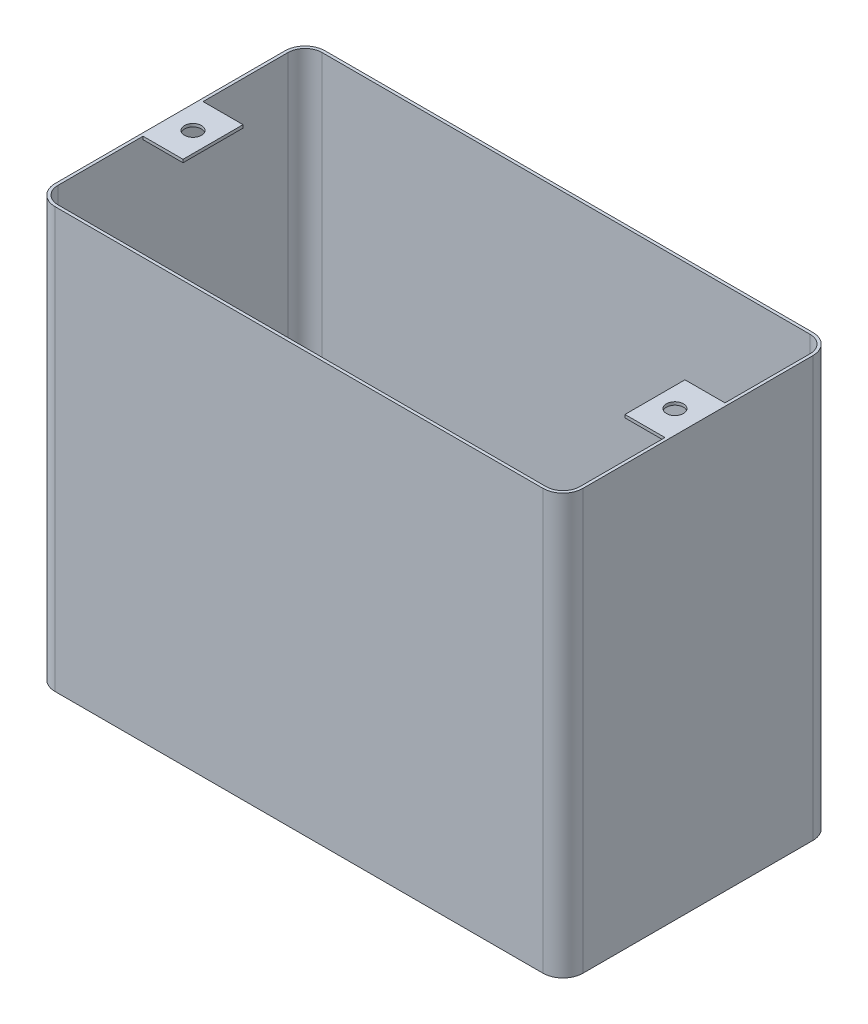
ISO-10303-21;
HEADER;
FILE_DESCRIPTION(('STEP AP214'),'2;1');
FILE_NAME('part.step','',(''),(''),'','','');
FILE_SCHEMA(('AUTOMOTIVE_DESIGN { 1 0 10303 214 1 1 1 1 }'));
ENDSEC;
DATA;
#1=APPLICATION_CONTEXT('core data for automotive mechanical design processes');
#2=APPLICATION_PROTOCOL_DEFINITION('international standard','automotive_design',2000,#1);
#3=PRODUCT_CONTEXT('',#1,'mechanical');
#4=PRODUCT('Part','Part','',(#3));
#5=PRODUCT_RELATED_PRODUCT_CATEGORY('part','',(#4));
#6=PRODUCT_DEFINITION_FORMATION('','',#4);
#7=PRODUCT_DEFINITION_CONTEXT('part definition',#1,'design');
#8=PRODUCT_DEFINITION('design','',#6,#7);
#9=PRODUCT_DEFINITION_SHAPE('','',#8);
#10=(LENGTH_UNIT() NAMED_UNIT(*) SI_UNIT(.MILLI.,.METRE.));
#11=(NAMED_UNIT(*) PLANE_ANGLE_UNIT() SI_UNIT($,.RADIAN.));
#12=(NAMED_UNIT(*) SI_UNIT($,.STERADIAN.) SOLID_ANGLE_UNIT());
#13=UNCERTAINTY_MEASURE_WITH_UNIT(LENGTH_MEASURE(1.E-05),#10,'distance_accuracy_value','');
#14=(GEOMETRIC_REPRESENTATION_CONTEXT(3) GLOBAL_UNCERTAINTY_ASSIGNED_CONTEXT((#13)) GLOBAL_UNIT_ASSIGNED_CONTEXT((#10,
#11,#12)) REPRESENTATION_CONTEXT('',''));
#15=CARTESIAN_POINT('',(0.,0.,0.));
#16=DIRECTION('',(0.,0.,1.));
#17=DIRECTION('',(1.,0.,0.));
#18=AXIS2_PLACEMENT_3D('',#15,#16,#17);
#19=CARTESIAN_POINT('',(254.,210.,-125.));
#20=DIRECTION('',(0.,1.,0.));
#21=DIRECTION('',(0.,0.,0.999999999999999));
#22=AXIS2_PLACEMENT_3D('',#19,#20,#21);
#23=PLANE('',#22);
#24=CARTESIAN_POINT('',(254.,210.,-125.));
#25=DIRECTION('',(0.,1.,0.));
#26=DIRECTION('',(0.,0.,-0.999999999999999));
#27=AXIS2_PLACEMENT_3D('',#24,#25,#26);
#28=CIRCLE('',#27,10.);
#29=CARTESIAN_POINT('',(264.,210.,-125.));
#30=VERTEX_POINT('',#29);
#31=CARTESIAN_POINT('',(254.,210.,-135.));
#32=VERTEX_POINT('',#31);
#33=EDGE_CURVE('E432',#30,#32,#28,.T.);
#34=ORIENTED_EDGE('',*,*,#33,.T.);
#35=DIRECTION('',(-1.,0.,0.));
#36=VECTOR('',#35,1.);
#37=CARTESIAN_POINT('',(10.0000000000001,210.,-135.));
#38=LINE('',#37,#36);
#39=CARTESIAN_POINT('',(10.0000000000001,210.,-135.));
#40=VERTEX_POINT('',#39);
#41=EDGE_CURVE('E436',#32,#40,#38,.T.);
#42=ORIENTED_EDGE('',*,*,#41,.T.);
#43=CARTESIAN_POINT('',(10.,210.,-125.));
#44=DIRECTION('',(0.,1.,0.));
#45=DIRECTION('',(0.,0.,-0.999999999999999));
#46=AXIS2_PLACEMENT_3D('',#43,#44,#45);
#47=CIRCLE('',#46,10.);
#48=CARTESIAN_POINT('',(0.,210.,-125.));
#49=VERTEX_POINT('',#48);
#50=EDGE_CURVE('E440',#40,#49,#47,.T.);
#51=ORIENTED_EDGE('',*,*,#50,.T.);
#52=DIRECTION('',(0.,0.,0.999999999999999));
#53=VECTOR('',#52,1.);
#54=CARTESIAN_POINT('',(0.,210.,-9.99999999999999));
#55=LINE('',#54,#53);
#56=CARTESIAN_POINT('',(0.,210.,-9.99999999999999));
#57=VERTEX_POINT('',#56);
#58=EDGE_CURVE('E443',#49,#57,#55,.T.);
#59=ORIENTED_EDGE('',*,*,#58,.T.);
#60=CARTESIAN_POINT('',(10.,210.,-9.9999999999999));
#61=DIRECTION('',(0.,1.,0.));
#62=DIRECTION('',(0.,0.,-0.999999999999999));
#63=AXIS2_PLACEMENT_3D('',#60,#61,#62);
#64=CIRCLE('',#63,10.);
#65=CARTESIAN_POINT('',(10.0000000000001,210.,0.));
#66=VERTEX_POINT('',#65);
#67=EDGE_CURVE('E446',#57,#66,#64,.T.);
#68=ORIENTED_EDGE('',*,*,#67,.T.);
#69=DIRECTION('',(1.,0.,0.));
#70=VECTOR('',#69,1.);
#71=CARTESIAN_POINT('',(10.0000000000001,210.,0.));
#72=LINE('',#71,#70);
#73=CARTESIAN_POINT('',(254.,210.,0.));
#74=VERTEX_POINT('',#73);
#75=EDGE_CURVE('E449',#66,#74,#72,.T.);
#76=ORIENTED_EDGE('',*,*,#75,.T.);
#77=CARTESIAN_POINT('',(254.,210.,-9.99999999999992));
#78=DIRECTION('',(0.,1.,0.));
#79=DIRECTION('',(0.,0.,0.999999999999999));
#80=AXIS2_PLACEMENT_3D('',#77,#78,#79);
#81=CIRCLE('',#80,10.);
#82=CARTESIAN_POINT('',(264.,210.,-9.99999999999999));
#83=VERTEX_POINT('',#82);
#84=EDGE_CURVE('E452',#74,#83,#81,.T.);
#85=ORIENTED_EDGE('',*,*,#84,.T.);
#86=DIRECTION('',(0.,0.,-0.999999999999999));
#87=VECTOR('',#86,1.);
#88=CARTESIAN_POINT('',(264.,210.,-9.99999999999999));
#89=LINE('',#88,#87);
#90=EDGE_CURVE('E455',#83,#30,#89,.T.);
#91=ORIENTED_EDGE('',*,*,#90,.T.);
#92=EDGE_LOOP('',(#34,#42,#51,#59,#68,#76,#85,#91));
#93=FACE_BOUND('',#92,.T.);
#94=DIRECTION('',(-1.,0.,0.));
#95=VECTOR('',#94,1.);
#96=CARTESIAN_POINT('',(254.,210.,-133.5));
#97=LINE('',#96,#95);
#98=CARTESIAN_POINT('',(254.,210.,-133.5));
#99=VERTEX_POINT('',#98);
#100=CARTESIAN_POINT('',(10.0000000000001,210.,-133.5));
#101=VERTEX_POINT('',#100);
#102=EDGE_CURVE('E350',#99,#101,#97,.T.);
#103=ORIENTED_EDGE('',*,*,#102,.F.);
#104=CARTESIAN_POINT('',(254.,210.,-125.));
#105=DIRECTION('',(0.,-1.,0.));
#106=DIRECTION('',(-1.,0.,0.));
#107=AXIS2_PLACEMENT_3D('',#104,#105,#106);
#108=CIRCLE('',#107,8.50000000000001);
#109=CARTESIAN_POINT('',(262.5,210.,-125.));
#110=VERTEX_POINT('',#109);
#111=EDGE_CURVE('E347',#110,#99,#108,.F.);
#112=ORIENTED_EDGE('',*,*,#111,.F.);
#113=DIRECTION('',(0.,0.,-0.999999999999999));
#114=VECTOR('',#113,1.);
#115=CARTESIAN_POINT('',(262.5,210.,-125.));
#116=LINE('',#115,#114);
#117=CARTESIAN_POINT('',(262.5,210.,-82.5000000000007));
#118=VERTEX_POINT('',#117);
#119=EDGE_CURVE('E371',#118,#110,#116,.T.);
#120=ORIENTED_EDGE('',*,*,#119,.F.);
#121=DIRECTION('',(-1.,0.,0.));
#122=VECTOR('',#121,1.);
#123=CARTESIAN_POINT('',(262.5,210.,-82.5000000000007));
#124=LINE('',#123,#122);
#125=CARTESIAN_POINT('',(242.5,210.,-82.5000000000005));
#126=VERTEX_POINT('',#125);
#127=EDGE_CURVE('E287',#118,#126,#124,.T.);
#128=ORIENTED_EDGE('',*,*,#127,.T.);
#129=DIRECTION('',(0.,0.,0.999999999999999));
#130=VECTOR('',#129,1.);
#131=CARTESIAN_POINT('',(242.500000000001,210.,-52.5000000000006));
#132=LINE('',#131,#130);
#133=CARTESIAN_POINT('',(242.500000000001,210.,-52.5000000000006));
#134=VERTEX_POINT('',#133);
#135=EDGE_CURVE('E258',#126,#134,#132,.T.);
#136=ORIENTED_EDGE('',*,*,#135,.T.);
#137=DIRECTION('',(1.,0.,0.));
#138=VECTOR('',#137,1.);
#139=CARTESIAN_POINT('',(262.500000000001,210.,-52.5000000000009));
#140=LINE('',#139,#138);
#141=CARTESIAN_POINT('',(262.5,210.,-52.5000000000006));
#142=VERTEX_POINT('',#141);
#143=EDGE_CURVE('E283',#134,#142,#140,.T.);
#144=ORIENTED_EDGE('',*,*,#143,.T.);
#145=CARTESIAN_POINT('',(262.5,210.,-9.99999999999999));
#146=VERTEX_POINT('',#145);
#147=EDGE_CURVE('E372',#146,#142,#116,.T.);
#148=ORIENTED_EDGE('',*,*,#147,.F.);
#149=CARTESIAN_POINT('',(254.,210.,-9.99999999999992));
#150=DIRECTION('',(0.,-1.,0.));
#151=DIRECTION('',(-1.,0.,0.));
#152=AXIS2_PLACEMENT_3D('',#149,#150,#151);
#153=CIRCLE('',#152,8.50000000000001);
#154=CARTESIAN_POINT('',(254.,210.,-1.5));
#155=VERTEX_POINT('',#154);
#156=EDGE_CURVE('E367',#155,#146,#153,.F.);
#157=ORIENTED_EDGE('',*,*,#156,.F.);
#158=DIRECTION('',(1.,0.,0.));
#159=VECTOR('',#158,1.);
#160=CARTESIAN_POINT('',(254.,210.,-1.5));
#161=LINE('',#160,#159);
#162=CARTESIAN_POINT('',(10.0000000000001,210.,-1.49999999999992));
#163=VERTEX_POINT('',#162);
#164=EDGE_CURVE('E364',#163,#155,#161,.T.);
#165=ORIENTED_EDGE('',*,*,#164,.F.);
#166=CARTESIAN_POINT('',(10.,210.,-9.9999999999999));
#167=DIRECTION('',(0.,-1.,0.));
#168=DIRECTION('',(-1.,0.,0.));
#169=AXIS2_PLACEMENT_3D('',#166,#167,#168);
#170=CIRCLE('',#169,8.5);
#171=CARTESIAN_POINT('',(1.5,210.,-9.99999999999999));
#172=VERTEX_POINT('',#171);
#173=EDGE_CURVE('E361',#172,#163,#170,.F.);
#174=ORIENTED_EDGE('',*,*,#173,.F.);
#175=DIRECTION('',(0.,0.,0.999999999999999));
#176=VECTOR('',#175,1.);
#177=CARTESIAN_POINT('',(1.5,210.,-125.));
#178=LINE('',#177,#176);
#179=CARTESIAN_POINT('',(1.5,210.,-52.4999999999999));
#180=VERTEX_POINT('',#179);
#181=EDGE_CURVE('E357',#180,#172,#178,.T.);
#182=ORIENTED_EDGE('',*,*,#181,.F.);
#183=DIRECTION('',(1.,0.,0.));
#184=VECTOR('',#183,1.);
#185=CARTESIAN_POINT('',(1.5,210.,-52.4999999999999));
#186=LINE('',#185,#184);
#187=CARTESIAN_POINT('',(21.5,210.,-52.4999999999999));
#188=VERTEX_POINT('',#187);
#189=EDGE_CURVE('E311',#180,#188,#186,.T.);
#190=ORIENTED_EDGE('',*,*,#189,.T.);
#191=DIRECTION('',(0.,0.,-0.999999999999999));
#192=VECTOR('',#191,1.);
#193=CARTESIAN_POINT('',(21.5,210.,-52.4999999999999));
#194=LINE('',#193,#192);
#195=CARTESIAN_POINT('',(21.5,210.,-82.4999999999998));
#196=VERTEX_POINT('',#195);
#197=EDGE_CURVE('E302',#188,#196,#194,.T.);
#198=ORIENTED_EDGE('',*,*,#197,.T.);
#199=DIRECTION('',(-1.,0.,0.));
#200=VECTOR('',#199,1.);
#201=CARTESIAN_POINT('',(1.5,210.,-82.4999999999998));
#202=LINE('',#201,#200);
#203=CARTESIAN_POINT('',(1.5,210.,-82.4999999999998));
#204=VERTEX_POINT('',#203);
#205=EDGE_CURVE('E326',#196,#204,#202,.T.);
#206=ORIENTED_EDGE('',*,*,#205,.T.);
#207=CARTESIAN_POINT('',(1.5,210.,-125.));
#208=VERTEX_POINT('',#207);
#209=EDGE_CURVE('E358',#208,#204,#178,.T.);
#210=ORIENTED_EDGE('',*,*,#209,.F.);
#211=CARTESIAN_POINT('',(10.,210.,-125.));
#212=DIRECTION('',(0.,-1.,0.));
#213=DIRECTION('',(-1.,0.,0.));
#214=AXIS2_PLACEMENT_3D('',#211,#212,#213);
#215=CIRCLE('',#214,8.50000000000001);
#216=EDGE_CURVE('E354',#101,#208,#215,.F.);
#217=ORIENTED_EDGE('',*,*,#216,.F.);
#218=EDGE_LOOP('',(#103,#112,#120,#128,#136,#144,#148,#157,#165,#174,#182,#190,#198,#206,#210,#217));
#219=FACE_BOUND('',#218,.T.);
#220=CARTESIAN_POINT('',(11.5,210.,-67.4999999999998));
#221=DIRECTION('',(0.,1.,0.));
#222=DIRECTION('',(0.,0.,0.999999999999999));
#223=AXIS2_PLACEMENT_3D('',#220,#221,#222);
#224=CIRCLE('',#223,4.25);
#225=CARTESIAN_POINT('',(11.5,210.,-63.2499999999998));
#226=VERTEX_POINT('',#225);
#227=EDGE_CURVE('E294',#226,#226,#224,.T.);
#228=ORIENTED_EDGE('',*,*,#227,.F.);
#229=EDGE_LOOP('',(#228));
#230=FACE_BOUND('',#229,.T.);
#231=CARTESIAN_POINT('',(252.500000000001,210.,-67.5000000000007));
#232=DIRECTION('',(0.,1.,0.));
#233=DIRECTION('',(0.,0.,-0.999999999999999));
#234=AXIS2_PLACEMENT_3D('',#231,#232,#233);
#235=CIRCLE('',#234,4.25000000000001);
#236=CARTESIAN_POINT('',(252.500000000001,210.,-71.7500000000007));
#237=VERTEX_POINT('',#236);
#238=EDGE_CURVE('E784',#237,#237,#235,.T.);
#239=ORIENTED_EDGE('',*,*,#238,.F.);
#240=EDGE_LOOP('',(#239));
#241=FACE_BOUND('',#240,.T.);
#242=ADVANCED_FACE('F91',(#93,#219,#230,#241),#23,.T.);
#243=CARTESIAN_POINT('',(254.,0.,-125.));
#244=DIRECTION('',(0.,1.,0.));
#245=DIRECTION('',(0.,0.,0.999999999999999));
#246=AXIS2_PLACEMENT_3D('',#243,#244,#245);
#247=PLANE('',#246);
#248=CARTESIAN_POINT('',(254.,0.,-125.));
#249=DIRECTION('',(0.,1.,0.));
#250=DIRECTION('',(0.,0.,-0.999999999999999));
#251=AXIS2_PLACEMENT_3D('',#248,#249,#250);
#252=CIRCLE('',#251,10.);
#253=CARTESIAN_POINT('',(264.,0.,-125.));
#254=VERTEX_POINT('',#253);
#255=CARTESIAN_POINT('',(254.,0.,-135.));
#256=VERTEX_POINT('',#255);
#257=EDGE_CURVE('E431',#254,#256,#252,.T.);
#258=ORIENTED_EDGE('',*,*,#257,.F.);
#259=DIRECTION('',(0.,0.,-0.999999999999999));
#260=VECTOR('',#259,1.);
#261=CARTESIAN_POINT('',(264.,0.,-10.0000000000001));
#262=LINE('',#261,#260);
#263=CARTESIAN_POINT('',(264.,0.,-10.0000000000001));
#264=VERTEX_POINT('',#263);
#265=EDGE_CURVE('E437',#264,#254,#262,.T.);
#266=ORIENTED_EDGE('',*,*,#265,.F.);
#267=CARTESIAN_POINT('',(254.,0.,-10.));
#268=DIRECTION('',(0.,1.,0.));
#269=DIRECTION('',(0.,0.,0.999999999999999));
#270=AXIS2_PLACEMENT_3D('',#267,#268,#269);
#271=CIRCLE('',#270,10.);
#272=CARTESIAN_POINT('',(254.,0.,0.));
#273=VERTEX_POINT('',#272);
#274=EDGE_CURVE('E477',#273,#264,#271,.T.);
#275=ORIENTED_EDGE('',*,*,#274,.F.);
#276=DIRECTION('',(1.,0.,0.));
#277=VECTOR('',#276,1.);
#278=CARTESIAN_POINT('',(10.0000000000001,0.,0.));
#279=LINE('',#278,#277);
#280=CARTESIAN_POINT('',(10.0000000000001,0.,0.));
#281=VERTEX_POINT('',#280);
#282=EDGE_CURVE('E474',#281,#273,#279,.T.);
#283=ORIENTED_EDGE('',*,*,#282,.F.);
#284=CARTESIAN_POINT('',(9.99999999999999,0.,-9.99999999999995));
#285=DIRECTION('',(0.,1.,0.));
#286=DIRECTION('',(0.,0.,-0.999999999999999));
#287=AXIS2_PLACEMENT_3D('',#284,#285,#286);
#288=CIRCLE('',#287,10.);
#289=CARTESIAN_POINT('',(0.,0.,-10.));
#290=VERTEX_POINT('',#289);
#291=EDGE_CURVE('E471',#290,#281,#288,.T.);
#292=ORIENTED_EDGE('',*,*,#291,.F.);
#293=DIRECTION('',(0.,0.,0.999999999999999));
#294=VECTOR('',#293,1.);
#295=CARTESIAN_POINT('',(0.,0.,-10.));
#296=LINE('',#295,#294);
#297=CARTESIAN_POINT('',(0.,0.,-125.));
#298=VERTEX_POINT('',#297);
#299=EDGE_CURVE('E468',#298,#290,#296,.T.);
#300=ORIENTED_EDGE('',*,*,#299,.F.);
#301=CARTESIAN_POINT('',(9.99999999999999,0.,-125.));
#302=DIRECTION('',(0.,1.,0.));
#303=DIRECTION('',(0.,0.,-0.999999999999999));
#304=AXIS2_PLACEMENT_3D('',#301,#302,#303);
#305=CIRCLE('',#304,10.);
#306=CARTESIAN_POINT('',(10.0000000000001,0.,-135.));
#307=VERTEX_POINT('',#306);
#308=EDGE_CURVE('E465',#307,#298,#305,.T.);
#309=ORIENTED_EDGE('',*,*,#308,.F.);
#310=DIRECTION('',(-1.,0.,0.));
#311=VECTOR('',#310,1.);
#312=CARTESIAN_POINT('',(10.0000000000001,0.,-135.));
#313=LINE('',#312,#311);
#314=EDGE_CURVE('E462',#256,#307,#313,.T.);
#315=ORIENTED_EDGE('',*,*,#314,.F.);
#316=EDGE_LOOP('',(#258,#266,#275,#283,#292,#300,#309,#315));
#317=FACE_BOUND('',#316,.T.);
#318=CARTESIAN_POINT('',(254.,0.,-125.));
#319=DIRECTION('',(0.,-1.,0.));
#320=DIRECTION('',(-1.,0.,0.));
#321=AXIS2_PLACEMENT_3D('',#318,#319,#320);
#322=CIRCLE('',#321,8.50000000000001);
#323=CARTESIAN_POINT('',(262.5,0.,-125.));
#324=VERTEX_POINT('',#323);
#325=CARTESIAN_POINT('',(254.,0.,-133.5));
#326=VERTEX_POINT('',#325);
#327=EDGE_CURVE('E336',#324,#326,#322,.F.);
#328=ORIENTED_EDGE('',*,*,#327,.T.);
#329=DIRECTION('',(-1.,0.,0.));
#330=VECTOR('',#329,1.);
#331=CARTESIAN_POINT('',(254.,0.,-133.5));
#332=LINE('',#331,#330);
#333=CARTESIAN_POINT('',(10.0000000000001,0.,-133.5));
#334=VERTEX_POINT('',#333);
#335=EDGE_CURVE('E379',#326,#334,#332,.T.);
#336=ORIENTED_EDGE('',*,*,#335,.T.);
#337=CARTESIAN_POINT('',(9.99999999999999,0.,-125.));
#338=DIRECTION('',(0.,-1.,0.));
#339=DIRECTION('',(-1.,0.,0.));
#340=AXIS2_PLACEMENT_3D('',#337,#338,#339);
#341=CIRCLE('',#340,8.50000000000001);
#342=CARTESIAN_POINT('',(1.5,0.,-125.));
#343=VERTEX_POINT('',#342);
#344=EDGE_CURVE('E383',#334,#343,#341,.F.);
#345=ORIENTED_EDGE('',*,*,#344,.T.);
#346=DIRECTION('',(0.,0.,0.999999999999999));
#347=VECTOR('',#346,1.);
#348=CARTESIAN_POINT('',(1.5,0.,-125.));
#349=LINE('',#348,#347);
#350=CARTESIAN_POINT('',(1.5,0.,-10.));
#351=VERTEX_POINT('',#350);
#352=EDGE_CURVE('E387',#343,#351,#349,.T.);
#353=ORIENTED_EDGE('',*,*,#352,.T.);
#354=CARTESIAN_POINT('',(9.99999999999999,0.,-9.99999999999995));
#355=DIRECTION('',(0.,-1.,0.));
#356=DIRECTION('',(-1.,0.,0.));
#357=AXIS2_PLACEMENT_3D('',#354,#355,#356);
#358=CIRCLE('',#357,8.5);
#359=CARTESIAN_POINT('',(10.0000000000001,0.,-1.5));
#360=VERTEX_POINT('',#359);
#361=EDGE_CURVE('E391',#351,#360,#358,.F.);
#362=ORIENTED_EDGE('',*,*,#361,.T.);
#363=DIRECTION('',(1.,0.,0.));
#364=VECTOR('',#363,1.);
#365=CARTESIAN_POINT('',(254.,0.,-1.50000000000008));
#366=LINE('',#365,#364);
#367=CARTESIAN_POINT('',(254.,0.,-1.50000000000007));
#368=VERTEX_POINT('',#367);
#369=EDGE_CURVE('E395',#360,#368,#366,.T.);
#370=ORIENTED_EDGE('',*,*,#369,.T.);
#371=CARTESIAN_POINT('',(254.,0.,-10.));
#372=DIRECTION('',(0.,-1.,0.));
#373=DIRECTION('',(-1.,0.,0.));
#374=AXIS2_PLACEMENT_3D('',#371,#372,#373);
#375=CIRCLE('',#374,8.50000000000001);
#376=CARTESIAN_POINT('',(262.5,0.,-10.0000000000001));
#377=VERTEX_POINT('',#376);
#378=EDGE_CURVE('E399',#368,#377,#375,.F.);
#379=ORIENTED_EDGE('',*,*,#378,.T.);
#380=DIRECTION('',(0.,0.,-0.999999999999999));
#381=VECTOR('',#380,1.);
#382=CARTESIAN_POINT('',(262.5,0.,-125.));
#383=LINE('',#382,#381);
#384=EDGE_CURVE('E351',#377,#324,#383,.T.);
#385=ORIENTED_EDGE('',*,*,#384,.T.);
#386=EDGE_LOOP('',(#328,#336,#345,#353,#362,#370,#379,#385));
#387=FACE_BOUND('',#386,.T.);
#388=ADVANCED_FACE('F517',(#317,#387),#247,.F.);
#389=CARTESIAN_POINT('',(254.,210.,-125.));
#390=DIRECTION('',(0.,-1.,0.));
#391=DIRECTION('',(0.,0.,-0.999999999999999));
#392=AXIS2_PLACEMENT_3D('',#389,#390,#391);
#393=CYLINDRICAL_SURFACE('',#392,10.);
#394=ORIENTED_EDGE('',*,*,#257,.T.);
#395=DIRECTION('',(0.,-1.,0.));
#396=VECTOR('',#395,1.);
#397=CARTESIAN_POINT('',(254.,210.,-135.));
#398=LINE('',#397,#396);
#399=EDGE_CURVE('E12',#32,#256,#398,.T.);
#400=ORIENTED_EDGE('',*,*,#399,.F.);
#401=ORIENTED_EDGE('',*,*,#33,.F.);
#402=DIRECTION('',(0.,-1.,0.));
#403=VECTOR('',#402,1.);
#404=CARTESIAN_POINT('',(264.,210.,-125.));
#405=LINE('',#404,#403);
#406=EDGE_CURVE('E458',#30,#254,#405,.T.);
#407=ORIENTED_EDGE('',*,*,#406,.T.);
#408=EDGE_LOOP('',(#394,#400,#401,#407));
#409=FACE_BOUND('',#408,.T.);
#410=ADVANCED_FACE('F93',(#409),#393,.T.);
#411=CARTESIAN_POINT('',(10.0000000000001,210.,-135.));
#412=DIRECTION('',(0.,0.,0.999999999999999));
#413=DIRECTION('',(1.,0.,0.));
#414=AXIS2_PLACEMENT_3D('',#411,#412,#413);
#415=PLANE('',#414);
#416=ORIENTED_EDGE('',*,*,#314,.T.);
#417=DIRECTION('',(0.,-1.,0.));
#418=VECTOR('',#417,1.);
#419=CARTESIAN_POINT('',(10.0000000000001,210.,-135.));
#420=LINE('',#419,#418);
#421=EDGE_CURVE('E100',#40,#307,#420,.T.);
#422=ORIENTED_EDGE('',*,*,#421,.F.);
#423=ORIENTED_EDGE('',*,*,#41,.F.);
#424=ORIENTED_EDGE('',*,*,#399,.T.);
#425=EDGE_LOOP('',(#416,#422,#423,#424));
#426=FACE_BOUND('',#425,.T.);
#427=ADVANCED_FACE('F535',(#426),#415,.F.);
#428=CARTESIAN_POINT('',(10.,210.,-125.));
#429=DIRECTION('',(0.,-1.,0.));
#430=DIRECTION('',(0.,0.,-0.999999999999999));
#431=AXIS2_PLACEMENT_3D('',#428,#429,#430);
#432=CYLINDRICAL_SURFACE('',#431,10.);
#433=ORIENTED_EDGE('',*,*,#308,.T.);
#434=DIRECTION('',(0.,-1.,0.));
#435=VECTOR('',#434,1.);
#436=CARTESIAN_POINT('',(0.,210.,-125.));
#437=LINE('',#436,#435);
#438=EDGE_CURVE('E501',#49,#298,#437,.T.);
#439=ORIENTED_EDGE('',*,*,#438,.F.);
#440=ORIENTED_EDGE('',*,*,#50,.F.);
#441=ORIENTED_EDGE('',*,*,#421,.T.);
#442=EDGE_LOOP('',(#433,#439,#440,#441));
#443=FACE_BOUND('',#442,.T.);
#444=ADVANCED_FACE('F511',(#443),#432,.T.);
#445=CARTESIAN_POINT('',(0.,210.,-9.99999999999999));
#446=DIRECTION('',(1.,0.,0.));
#447=DIRECTION('',(0.,0.,-0.999999999999999));
#448=AXIS2_PLACEMENT_3D('',#445,#446,#447);
#449=PLANE('',#448);
#450=ORIENTED_EDGE('',*,*,#299,.T.);
#451=DIRECTION('',(0.,-1.,0.));
#452=VECTOR('',#451,1.);
#453=CARTESIAN_POINT('',(0.,210.,-9.99999999999999));
#454=LINE('',#453,#452);
#455=EDGE_CURVE('E497',#57,#290,#454,.T.);
#456=ORIENTED_EDGE('',*,*,#455,.F.);
#457=ORIENTED_EDGE('',*,*,#58,.F.);
#458=ORIENTED_EDGE('',*,*,#438,.T.);
#459=EDGE_LOOP('',(#450,#456,#457,#458));
#460=FACE_BOUND('',#459,.T.);
#461=ADVANCED_FACE('F523',(#460),#449,.F.);
#462=CARTESIAN_POINT('',(10.,210.,-9.9999999999999));
#463=DIRECTION('',(0.,-1.,0.));
#464=DIRECTION('',(0.,0.,-0.999999999999999));
#465=AXIS2_PLACEMENT_3D('',#462,#463,#464);
#466=CYLINDRICAL_SURFACE('',#465,10.);
#467=ORIENTED_EDGE('',*,*,#291,.T.);
#468=DIRECTION('',(0.,-1.,0.));
#469=VECTOR('',#468,1.);
#470=CARTESIAN_POINT('',(10.0000000000001,210.,0.));
#471=LINE('',#470,#469);
#472=EDGE_CURVE('E493',#66,#281,#471,.T.);
#473=ORIENTED_EDGE('',*,*,#472,.F.);
#474=ORIENTED_EDGE('',*,*,#67,.F.);
#475=ORIENTED_EDGE('',*,*,#455,.T.);
#476=EDGE_LOOP('',(#467,#473,#474,#475));
#477=FACE_BOUND('',#476,.T.);
#478=ADVANCED_FACE('F527',(#477),#466,.T.);
#479=CARTESIAN_POINT('',(10.0000000000001,210.,0.));
#480=DIRECTION('',(0.,0.,-0.999999999999999));
#481=DIRECTION('',(-1.,0.,0.));
#482=AXIS2_PLACEMENT_3D('',#479,#480,#481);
#483=PLANE('',#482);
#484=ORIENTED_EDGE('',*,*,#282,.T.);
#485=DIRECTION('',(0.,-1.,0.));
#486=VECTOR('',#485,1.);
#487=CARTESIAN_POINT('',(254.,210.,0.));
#488=LINE('',#487,#486);
#489=EDGE_CURVE('E489',#74,#273,#488,.T.);
#490=ORIENTED_EDGE('',*,*,#489,.F.);
#491=ORIENTED_EDGE('',*,*,#75,.F.);
#492=ORIENTED_EDGE('',*,*,#472,.T.);
#493=EDGE_LOOP('',(#484,#490,#491,#492));
#494=FACE_BOUND('',#493,.T.);
#495=ADVANCED_FACE('F548',(#494),#483,.F.);
#496=CARTESIAN_POINT('',(254.,210.,-9.99999999999992));
#497=DIRECTION('',(0.,-1.,0.));
#498=DIRECTION('',(0.,0.,-0.999999999999999));
#499=AXIS2_PLACEMENT_3D('',#496,#497,#498);
#500=CYLINDRICAL_SURFACE('',#499,10.);
#501=ORIENTED_EDGE('',*,*,#274,.T.);
#502=DIRECTION('',(0.,-1.,0.));
#503=VECTOR('',#502,1.);
#504=CARTESIAN_POINT('',(264.,210.,-9.99999999999999));
#505=LINE('',#504,#503);
#506=EDGE_CURVE('E485',#83,#264,#505,.T.);
#507=ORIENTED_EDGE('',*,*,#506,.F.);
#508=ORIENTED_EDGE('',*,*,#84,.F.);
#509=ORIENTED_EDGE('',*,*,#489,.T.);
#510=EDGE_LOOP('',(#501,#507,#508,#509));
#511=FACE_BOUND('',#510,.T.);
#512=ADVANCED_FACE('F546',(#511),#500,.T.);
#513=CARTESIAN_POINT('',(264.,210.,-9.99999999999999));
#514=DIRECTION('',(-1.,0.,0.));
#515=DIRECTION('',(0.,0.,0.999999999999999));
#516=AXIS2_PLACEMENT_3D('',#513,#514,#515);
#517=PLANE('',#516);
#518=ORIENTED_EDGE('',*,*,#265,.T.);
#519=ORIENTED_EDGE('',*,*,#406,.F.);
#520=ORIENTED_EDGE('',*,*,#90,.F.);
#521=ORIENTED_EDGE('',*,*,#506,.T.);
#522=EDGE_LOOP('',(#518,#519,#520,#521));
#523=FACE_BOUND('',#522,.T.);
#524=ADVANCED_FACE('F541',(#523),#517,.F.);
#525=CARTESIAN_POINT('',(254.,210.,-125.));
#526=DIRECTION('',(0.,-1.,0.));
#527=DIRECTION('',(0.,0.,-0.999999999999999));
#528=AXIS2_PLACEMENT_3D('',#525,#526,#527);
#529=CYLINDRICAL_SURFACE('',#528,8.50000000000001);
#530=ORIENTED_EDGE('',*,*,#327,.F.);
#531=DIRECTION('',(0.,-1.,0.));
#532=VECTOR('',#531,1.);
#533=CARTESIAN_POINT('',(262.5,210.,-125.));
#534=LINE('',#533,#532);
#535=EDGE_CURVE('E375',#110,#324,#534,.T.);
#536=ORIENTED_EDGE('',*,*,#535,.F.);
#537=ORIENTED_EDGE('',*,*,#111,.T.);
#538=DIRECTION('',(0.,-1.,0.));
#539=VECTOR('',#538,1.);
#540=CARTESIAN_POINT('',(254.,210.,-133.5));
#541=LINE('',#540,#539);
#542=EDGE_CURVE('E427',#99,#326,#541,.T.);
#543=ORIENTED_EDGE('',*,*,#542,.T.);
#544=EDGE_LOOP('',(#530,#536,#537,#543));
#545=FACE_BOUND('',#544,.T.);
#546=ADVANCED_FACE('F564',(#545),#529,.F.);
#547=CARTESIAN_POINT('',(254.,210.,-133.5));
#548=DIRECTION('',(0.,0.,0.999999999999999));
#549=DIRECTION('',(1.,0.,0.));
#550=AXIS2_PLACEMENT_3D('',#547,#548,#549);
#551=PLANE('',#550);
#552=ORIENTED_EDGE('',*,*,#335,.F.);
#553=ORIENTED_EDGE('',*,*,#542,.F.);
#554=ORIENTED_EDGE('',*,*,#102,.T.);
#555=DIRECTION('',(0.,-1.,0.));
#556=VECTOR('',#555,1.);
#557=CARTESIAN_POINT('',(10.0000000000001,210.,-133.5));
#558=LINE('',#557,#556);
#559=EDGE_CURVE('E424',#101,#334,#558,.T.);
#560=ORIENTED_EDGE('',*,*,#559,.T.);
#561=EDGE_LOOP('',(#552,#553,#554,#560));
#562=FACE_BOUND('',#561,.T.);
#563=ADVANCED_FACE('F571',(#562),#551,.T.);
#564=CARTESIAN_POINT('',(10.,210.,-125.));
#565=DIRECTION('',(0.,-1.,0.));
#566=DIRECTION('',(0.,0.,-0.999999999999999));
#567=AXIS2_PLACEMENT_3D('',#564,#565,#566);
#568=CYLINDRICAL_SURFACE('',#567,8.50000000000001);
#569=ORIENTED_EDGE('',*,*,#344,.F.);
#570=ORIENTED_EDGE('',*,*,#559,.F.);
#571=ORIENTED_EDGE('',*,*,#216,.T.);
#572=DIRECTION('',(0.,-1.,0.));
#573=VECTOR('',#572,1.);
#574=CARTESIAN_POINT('',(1.5,210.,-125.));
#575=LINE('',#574,#573);
#576=EDGE_CURVE('E421',#208,#343,#575,.T.);
#577=ORIENTED_EDGE('',*,*,#576,.T.);
#578=EDGE_LOOP('',(#569,#570,#571,#577));
#579=FACE_BOUND('',#578,.T.);
#580=ADVANCED_FACE('F576',(#579),#568,.F.);
#581=CARTESIAN_POINT('',(1.5,210.,-125.));
#582=DIRECTION('',(1.,0.,0.));
#583=DIRECTION('',(0.,0.,-0.999999999999999));
#584=AXIS2_PLACEMENT_3D('',#581,#582,#583);
#585=PLANE('',#584);
#586=DIRECTION('',(0.,1.,0.));
#587=VECTOR('',#586,1.);
#588=CARTESIAN_POINT('',(1.5,208.5,-52.4999999999999));
#589=LINE('',#588,#587);
#590=CARTESIAN_POINT('',(1.5,208.5,-52.4999999999999));
#591=VERTEX_POINT('',#590);
#592=EDGE_CURVE('E337',#591,#180,#589,.T.);
#593=ORIENTED_EDGE('',*,*,#592,.T.);
#594=ORIENTED_EDGE('',*,*,#181,.T.);
#595=DIRECTION('',(0.,-1.,0.));
#596=VECTOR('',#595,1.);
#597=CARTESIAN_POINT('',(1.5,210.,-9.99999999999999));
#598=LINE('',#597,#596);
#599=EDGE_CURVE('E418',#172,#351,#598,.T.);
#600=ORIENTED_EDGE('',*,*,#599,.T.);
#601=ORIENTED_EDGE('',*,*,#352,.F.);
#602=ORIENTED_EDGE('',*,*,#576,.F.);
#603=ORIENTED_EDGE('',*,*,#209,.T.);
#604=DIRECTION('',(0.,1.,0.));
#605=VECTOR('',#604,1.);
#606=CARTESIAN_POINT('',(1.5,208.5,-82.4999999999998));
#607=LINE('',#606,#605);
#608=CARTESIAN_POINT('',(1.5,208.5,-82.4999999999998));
#609=VERTEX_POINT('',#608);
#610=EDGE_CURVE('E341',#609,#204,#607,.T.);
#611=ORIENTED_EDGE('',*,*,#610,.F.);
#612=DIRECTION('',(0.,0.,0.999999999999999));
#613=VECTOR('',#612,1.);
#614=CARTESIAN_POINT('',(1.5,208.5,-52.4999999999999));
#615=LINE('',#614,#613);
#616=EDGE_CURVE('E315',#609,#591,#615,.T.);
#617=ORIENTED_EDGE('',*,*,#616,.T.);
#618=EDGE_LOOP('',(#593,#594,#600,#601,#602,#603,#611,#617));
#619=FACE_BOUND('',#618,.T.);
#620=ADVANCED_FACE('F634',(#619),#585,.T.);
#621=CARTESIAN_POINT('',(10.,210.,-9.9999999999999));
#622=DIRECTION('',(0.,-1.,0.));
#623=DIRECTION('',(0.,0.,-0.999999999999999));
#624=AXIS2_PLACEMENT_3D('',#621,#622,#623);
#625=CYLINDRICAL_SURFACE('',#624,8.5);
#626=ORIENTED_EDGE('',*,*,#361,.F.);
#627=ORIENTED_EDGE('',*,*,#599,.F.);
#628=ORIENTED_EDGE('',*,*,#173,.T.);
#629=DIRECTION('',(0.,-1.,0.));
#630=VECTOR('',#629,1.);
#631=CARTESIAN_POINT('',(10.0000000000001,210.,-1.49999999999992));
#632=LINE('',#631,#630);
#633=EDGE_CURVE('E415',#163,#360,#632,.T.);
#634=ORIENTED_EDGE('',*,*,#633,.T.);
#635=EDGE_LOOP('',(#626,#627,#628,#634));
#636=FACE_BOUND('',#635,.T.);
#637=ADVANCED_FACE('F641',(#636),#625,.F.);
#638=CARTESIAN_POINT('',(254.,210.,-1.5));
#639=DIRECTION('',(0.,0.,-0.999999999999999));
#640=DIRECTION('',(-1.,0.,0.));
#641=AXIS2_PLACEMENT_3D('',#638,#639,#640);
#642=PLANE('',#641);
#643=ORIENTED_EDGE('',*,*,#369,.F.);
#644=ORIENTED_EDGE('',*,*,#633,.F.);
#645=ORIENTED_EDGE('',*,*,#164,.T.);
#646=DIRECTION('',(0.,-1.,0.));
#647=VECTOR('',#646,1.);
#648=CARTESIAN_POINT('',(254.,210.,-1.5));
#649=LINE('',#648,#647);
#650=EDGE_CURVE('E412',#155,#368,#649,.T.);
#651=ORIENTED_EDGE('',*,*,#650,.T.);
#652=EDGE_LOOP('',(#643,#644,#645,#651));
#653=FACE_BOUND('',#652,.T.);
#654=ADVANCED_FACE('F645',(#653),#642,.T.);
#655=CARTESIAN_POINT('',(254.,210.,-9.99999999999992));
#656=DIRECTION('',(0.,-1.,0.));
#657=DIRECTION('',(0.,0.,-0.999999999999999));
#658=AXIS2_PLACEMENT_3D('',#655,#656,#657);
#659=CYLINDRICAL_SURFACE('',#658,8.50000000000001);
#660=ORIENTED_EDGE('',*,*,#378,.F.);
#661=ORIENTED_EDGE('',*,*,#650,.F.);
#662=ORIENTED_EDGE('',*,*,#156,.T.);
#663=DIRECTION('',(0.,-1.,0.));
#664=VECTOR('',#663,1.);
#665=CARTESIAN_POINT('',(262.5,210.,-9.99999999999999));
#666=LINE('',#665,#664);
#667=EDGE_CURVE('E409',#146,#377,#666,.T.);
#668=ORIENTED_EDGE('',*,*,#667,.T.);
#669=EDGE_LOOP('',(#660,#661,#662,#668));
#670=FACE_BOUND('',#669,.T.);
#671=ADVANCED_FACE('F587',(#670),#659,.F.);
#672=CARTESIAN_POINT('',(262.5,210.,-125.));
#673=DIRECTION('',(-1.,0.,0.));
#674=DIRECTION('',(0.,0.,0.999999999999999));
#675=AXIS2_PLACEMENT_3D('',#672,#673,#674);
#676=PLANE('',#675);
#677=DIRECTION('',(0.,1.,0.));
#678=VECTOR('',#677,1.);
#679=CARTESIAN_POINT('',(262.500000000001,208.5,-52.5000000000009));
#680=LINE('',#679,#678);
#681=CARTESIAN_POINT('',(262.5,208.5,-52.5000000000006));
#682=VERTEX_POINT('',#681);
#683=EDGE_CURVE('E107',#682,#142,#680,.T.);
#684=ORIENTED_EDGE('',*,*,#683,.F.);
#685=DIRECTION('',(0.,0.,-0.999999999999999));
#686=VECTOR('',#685,1.);
#687=CARTESIAN_POINT('',(262.500000000001,208.5,-52.5000000000009));
#688=LINE('',#687,#686);
#689=CARTESIAN_POINT('',(262.5,208.5,-82.5000000000007));
#690=VERTEX_POINT('',#689);
#691=EDGE_CURVE('E111',#682,#690,#688,.T.);
#692=ORIENTED_EDGE('',*,*,#691,.T.);
#693=DIRECTION('',(0.,1.,0.));
#694=VECTOR('',#693,1.);
#695=CARTESIAN_POINT('',(262.5,208.5,-82.5000000000007));
#696=LINE('',#695,#694);
#697=EDGE_CURVE('E264',#690,#118,#696,.T.);
#698=ORIENTED_EDGE('',*,*,#697,.T.);
#699=ORIENTED_EDGE('',*,*,#119,.T.);
#700=ORIENTED_EDGE('',*,*,#535,.T.);
#701=ORIENTED_EDGE('',*,*,#384,.F.);
#702=ORIENTED_EDGE('',*,*,#667,.F.);
#703=ORIENTED_EDGE('',*,*,#147,.T.);
#704=EDGE_LOOP('',(#684,#692,#698,#699,#700,#701,#702,#703));
#705=FACE_BOUND('',#704,.T.);
#706=ADVANCED_FACE('F582',(#705),#676,.T.);
#707=CARTESIAN_POINT('',(21.5,208.5,-52.4999999999999));
#708=DIRECTION('',(1.,0.,0.));
#709=DIRECTION('',(0.,0.,-0.999999999999999));
#710=AXIS2_PLACEMENT_3D('',#707,#708,#709);
#711=PLANE('',#710);
#712=ORIENTED_EDGE('',*,*,#197,.F.);
#713=DIRECTION('',(0.,1.,0.));
#714=VECTOR('',#713,1.);
#715=CARTESIAN_POINT('',(21.5,208.5,-52.4999999999999));
#716=LINE('',#715,#714);
#717=CARTESIAN_POINT('',(21.5,208.5,-52.4999999999999));
#718=VERTEX_POINT('',#717);
#719=EDGE_CURVE('E333',#718,#188,#716,.T.);
#720=ORIENTED_EDGE('',*,*,#719,.F.);
#721=DIRECTION('',(0.,0.,-0.999999999999999));
#722=VECTOR('',#721,1.);
#723=CARTESIAN_POINT('',(21.5,208.5,-52.4999999999999));
#724=LINE('',#723,#722);
#725=CARTESIAN_POINT('',(21.5,208.5,-82.4999999999998));
#726=VERTEX_POINT('',#725);
#727=EDGE_CURVE('E306',#718,#726,#724,.T.);
#728=ORIENTED_EDGE('',*,*,#727,.T.);
#729=DIRECTION('',(0.,1.,0.));
#730=VECTOR('',#729,1.);
#731=CARTESIAN_POINT('',(21.5,208.5,-82.4999999999998));
#732=LINE('',#731,#730);
#733=EDGE_CURVE('E322',#726,#196,#732,.T.);
#734=ORIENTED_EDGE('',*,*,#733,.T.);
#735=EDGE_LOOP('',(#712,#720,#728,#734));
#736=FACE_BOUND('',#735,.T.);
#737=ADVANCED_FACE('F664',(#736),#711,.T.);
#738=CARTESIAN_POINT('',(1.5,208.5,-52.4999999999999));
#739=DIRECTION('',(0.,0.,0.999999999999999));
#740=DIRECTION('',(1.,0.,0.));
#741=AXIS2_PLACEMENT_3D('',#738,#739,#740);
#742=PLANE('',#741);
#743=ORIENTED_EDGE('',*,*,#189,.F.);
#744=ORIENTED_EDGE('',*,*,#592,.F.);
#745=DIRECTION('',(1.,0.,0.));
#746=VECTOR('',#745,1.);
#747=CARTESIAN_POINT('',(1.5,208.5,-52.4999999999999));
#748=LINE('',#747,#746);
#749=EDGE_CURVE('E318',#591,#718,#748,.T.);
#750=ORIENTED_EDGE('',*,*,#749,.T.);
#751=ORIENTED_EDGE('',*,*,#719,.T.);
#752=EDGE_LOOP('',(#743,#744,#750,#751));
#753=FACE_BOUND('',#752,.T.);
#754=ADVANCED_FACE('F662',(#753),#742,.T.);
#755=CARTESIAN_POINT('',(1.5,208.5,-82.4999999999998));
#756=DIRECTION('',(0.,0.,-0.999999999999999));
#757=DIRECTION('',(-1.,0.,0.));
#758=AXIS2_PLACEMENT_3D('',#755,#756,#757);
#759=PLANE('',#758);
#760=ORIENTED_EDGE('',*,*,#205,.F.);
#761=ORIENTED_EDGE('',*,*,#733,.F.);
#762=DIRECTION('',(-1.,0.,0.));
#763=VECTOR('',#762,1.);
#764=CARTESIAN_POINT('',(1.5,208.5,-82.4999999999998));
#765=LINE('',#764,#763);
#766=EDGE_CURVE('E310',#726,#609,#765,.T.);
#767=ORIENTED_EDGE('',*,*,#766,.T.);
#768=ORIENTED_EDGE('',*,*,#610,.T.);
#769=EDGE_LOOP('',(#760,#761,#767,#768));
#770=FACE_BOUND('',#769,.T.);
#771=ADVANCED_FACE('F654',(#770),#759,.T.);
#772=CARTESIAN_POINT('',(0.,208.5,0.));
#773=DIRECTION('',(0.,-1.,0.));
#774=DIRECTION('',(0.,0.,-0.999999999999999));
#775=AXIS2_PLACEMENT_3D('',#772,#773,#774);
#776=PLANE('',#775);
#777=CARTESIAN_POINT('',(11.5,208.5,-67.4999999999998));
#778=DIRECTION('',(0.,1.,0.));
#779=DIRECTION('',(0.,0.,0.999999999999999));
#780=AXIS2_PLACEMENT_3D('',#777,#778,#779);
#781=CIRCLE('',#780,4.25);
#782=CARTESIAN_POINT('',(11.5,208.5,-63.2499999999998));
#783=VERTEX_POINT('',#782);
#784=EDGE_CURVE('E298',#783,#783,#781,.T.);
#785=ORIENTED_EDGE('',*,*,#784,.T.);
#786=EDGE_LOOP('',(#785));
#787=FACE_BOUND('',#786,.T.);
#788=ORIENTED_EDGE('',*,*,#727,.F.);
#789=ORIENTED_EDGE('',*,*,#749,.F.);
#790=ORIENTED_EDGE('',*,*,#616,.F.);
#791=ORIENTED_EDGE('',*,*,#766,.F.);
#792=EDGE_LOOP('',(#788,#789,#790,#791));
#793=FACE_BOUND('',#792,.T.);
#794=ADVANCED_FACE('F660',(#787,#793),#776,.T.);
#795=CARTESIAN_POINT('',(11.5,208.5,-67.4999999999998));
#796=DIRECTION('',(0.,1.,0.));
#797=DIRECTION('',(0.,0.,0.999999999999999));
#798=AXIS2_PLACEMENT_3D('',#795,#796,#797);
#799=CYLINDRICAL_SURFACE('',#798,4.25);
#800=ORIENTED_EDGE('',*,*,#784,.F.);
#801=EDGE_LOOP('',(#800));
#802=FACE_BOUND('',#801,.T.);
#803=ORIENTED_EDGE('',*,*,#227,.T.);
#804=EDGE_LOOP('',(#803));
#805=FACE_BOUND('',#804,.T.);
#806=ADVANCED_FACE('F736',(#802,#805),#799,.F.);
#807=CARTESIAN_POINT('',(262.500000000001,208.5,-52.5000000000009));
#808=DIRECTION('',(0.,0.,0.999999999999999));
#809=DIRECTION('',(1.,0.,0.));
#810=AXIS2_PLACEMENT_3D('',#807,#808,#809);
#811=PLANE('',#810);
#812=ORIENTED_EDGE('',*,*,#143,.F.);
#813=DIRECTION('',(0.,1.,0.));
#814=VECTOR('',#813,1.);
#815=CARTESIAN_POINT('',(242.500000000001,208.5,-52.5000000000006));
#816=LINE('',#815,#814);
#817=CARTESIAN_POINT('',(242.500000000001,208.5,-52.5000000000006));
#818=VERTEX_POINT('',#817);
#819=EDGE_CURVE('E263',#818,#134,#816,.T.);
#820=ORIENTED_EDGE('',*,*,#819,.F.);
#821=DIRECTION('',(1.,0.,0.));
#822=VECTOR('',#821,1.);
#823=CARTESIAN_POINT('',(262.500000000001,208.5,-52.5000000000009));
#824=LINE('',#823,#822);
#825=EDGE_CURVE('E275',#818,#682,#824,.T.);
#826=ORIENTED_EDGE('',*,*,#825,.T.);
#827=ORIENTED_EDGE('',*,*,#683,.T.);
#828=EDGE_LOOP('',(#812,#820,#826,#827));
#829=FACE_BOUND('',#828,.T.);
#830=ADVANCED_FACE('F592',(#829),#811,.T.);
#831=CARTESIAN_POINT('',(242.500000000001,208.5,-52.5000000000006));
#832=DIRECTION('',(-1.,0.,0.));
#833=DIRECTION('',(0.,0.,0.999999999999999));
#834=AXIS2_PLACEMENT_3D('',#831,#832,#833);
#835=PLANE('',#834);
#836=ORIENTED_EDGE('',*,*,#135,.F.);
#837=DIRECTION('',(0.,1.,0.));
#838=VECTOR('',#837,1.);
#839=CARTESIAN_POINT('',(242.5,208.5,-82.5000000000005));
#840=LINE('',#839,#838);
#841=CARTESIAN_POINT('',(242.5,208.5,-82.5000000000005));
#842=VERTEX_POINT('',#841);
#843=EDGE_CURVE('E252',#842,#126,#840,.T.);
#844=ORIENTED_EDGE('',*,*,#843,.F.);
#845=DIRECTION('',(0.,0.,0.999999999999999));
#846=VECTOR('',#845,1.);
#847=CARTESIAN_POINT('',(242.500000000001,208.5,-52.5000000000006));
#848=LINE('',#847,#846);
#849=EDGE_CURVE('E256',#842,#818,#848,.T.);
#850=ORIENTED_EDGE('',*,*,#849,.T.);
#851=ORIENTED_EDGE('',*,*,#819,.T.);
#852=EDGE_LOOP('',(#836,#844,#850,#851));
#853=FACE_BOUND('',#852,.T.);
#854=ADVANCED_FACE('F254',(#853),#835,.T.);
#855=CARTESIAN_POINT('',(262.5,208.5,-82.5000000000007));
#856=DIRECTION('',(0.,0.,-0.999999999999999));
#857=DIRECTION('',(-1.,0.,0.));
#858=AXIS2_PLACEMENT_3D('',#855,#856,#857);
#859=PLANE('',#858);
#860=ORIENTED_EDGE('',*,*,#127,.F.);
#861=ORIENTED_EDGE('',*,*,#697,.F.);
#862=DIRECTION('',(-1.,0.,0.));
#863=VECTOR('',#862,1.);
#864=CARTESIAN_POINT('',(262.5,208.5,-82.5000000000007));
#865=LINE('',#864,#863);
#866=EDGE_CURVE('E267',#690,#842,#865,.T.);
#867=ORIENTED_EDGE('',*,*,#866,.T.);
#868=ORIENTED_EDGE('',*,*,#843,.T.);
#869=EDGE_LOOP('',(#860,#861,#867,#868));
#870=FACE_BOUND('',#869,.T.);
#871=ADVANCED_FACE('F268',(#870),#859,.T.);
#872=CARTESIAN_POINT('',(0.,208.5,0.));
#873=DIRECTION('',(0.,-1.,0.));
#874=DIRECTION('',(0.,0.,-0.999999999999999));
#875=AXIS2_PLACEMENT_3D('',#872,#873,#874);
#876=PLANE('',#875);
#877=CARTESIAN_POINT('',(252.500000000001,208.5,-67.5000000000007));
#878=DIRECTION('',(0.,1.,0.));
#879=DIRECTION('',(0.,0.,-0.999999999999999));
#880=AXIS2_PLACEMENT_3D('',#877,#878,#879);
#881=CIRCLE('',#880,4.25000000000001);
#882=CARTESIAN_POINT('',(252.500000000001,208.5,-71.7500000000007));
#883=VERTEX_POINT('',#882);
#884=EDGE_CURVE('E288',#883,#883,#881,.T.);
#885=ORIENTED_EDGE('',*,*,#884,.T.);
#886=EDGE_LOOP('',(#885));
#887=FACE_BOUND('',#886,.T.);
#888=ORIENTED_EDGE('',*,*,#825,.F.);
#889=ORIENTED_EDGE('',*,*,#849,.F.);
#890=ORIENTED_EDGE('',*,*,#866,.F.);
#891=ORIENTED_EDGE('',*,*,#691,.F.);
#892=EDGE_LOOP('',(#888,#889,#890,#891));
#893=FACE_BOUND('',#892,.T.);
#894=ADVANCED_FACE('F273',(#887,#893),#876,.T.);
#895=CARTESIAN_POINT('',(252.500000000001,208.5,-67.5000000000007));
#896=DIRECTION('',(0.,1.,0.));
#897=DIRECTION('',(0.,0.,0.999999999999999));
#898=AXIS2_PLACEMENT_3D('',#895,#896,#897);
#899=CYLINDRICAL_SURFACE('',#898,4.25000000000001);
#900=ORIENTED_EDGE('',*,*,#884,.F.);
#901=EDGE_LOOP('',(#900));
#902=FACE_BOUND('',#901,.T.);
#903=ORIENTED_EDGE('',*,*,#238,.T.);
#904=EDGE_LOOP('',(#903));
#905=FACE_BOUND('',#904,.T.);
#906=ADVANCED_FACE('F769',(#902,#905),#899,.F.);
#907=CLOSED_SHELL('',(#242,#388,#410,#427,#444,#461,#478,#495,#512,#524,#546,#563,#580,#620,
#637,#654,#671,#706,#737,#754,#771,#794,#806,#830,#854,#871,#894,#906));
#908=MANIFOLD_SOLID_BREP('B2',#907);
#909=ADVANCED_BREP_SHAPE_REPRESENTATION('',(#18,#908),#14);
#910=SHAPE_DEFINITION_REPRESENTATION(#9,#909);
ENDSEC;
END-ISO-10303-21;
